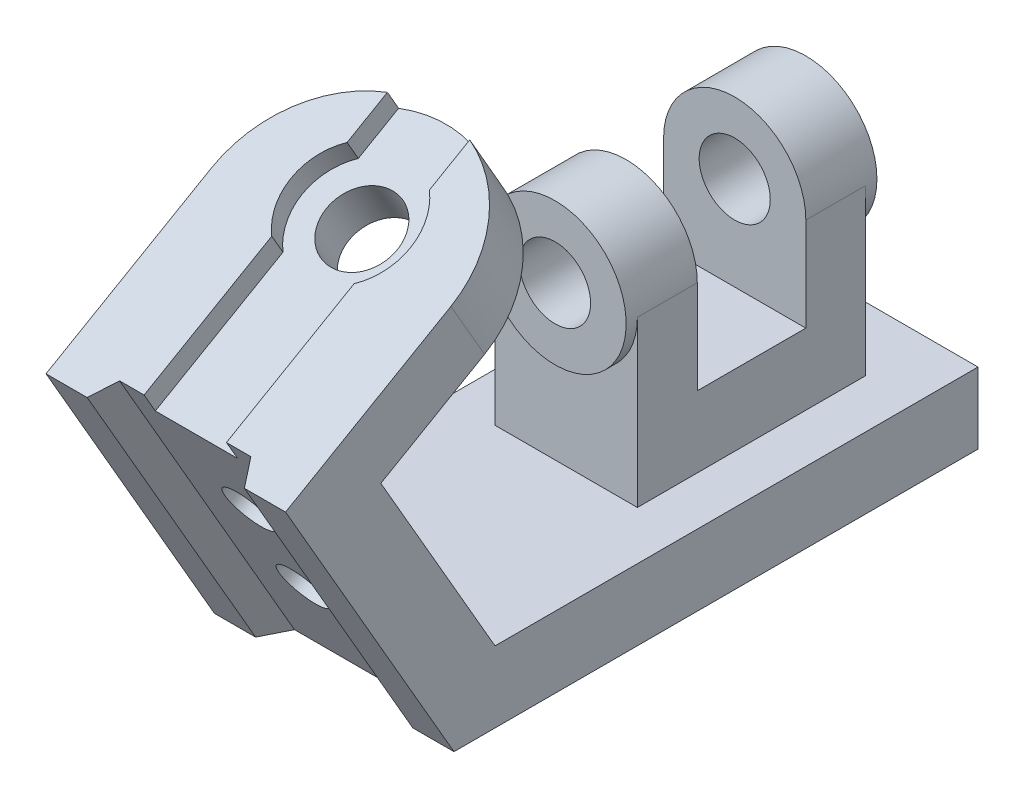
ISO-10303-21;
HEADER;
FILE_DESCRIPTION(('STEP AP214'),'2;1');
FILE_NAME('part.step','',(''),(''),'','','');
FILE_SCHEMA(('AUTOMOTIVE_DESIGN { 1 0 10303 214 1 1 1 1 }'));
ENDSEC;
DATA;
#1=APPLICATION_CONTEXT('core data for automotive mechanical design processes');
#2=APPLICATION_PROTOCOL_DEFINITION('international standard','automotive_design',2000,#1);
#3=PRODUCT_CONTEXT('',#1,'mechanical');
#4=PRODUCT('Part','Part','',(#3));
#5=PRODUCT_RELATED_PRODUCT_CATEGORY('part','',(#4));
#6=PRODUCT_DEFINITION_FORMATION('','',#4);
#7=PRODUCT_DEFINITION_CONTEXT('part definition',#1,'design');
#8=PRODUCT_DEFINITION('design','',#6,#7);
#9=PRODUCT_DEFINITION_SHAPE('','',#8);
#10=(LENGTH_UNIT() NAMED_UNIT(*) SI_UNIT(.MILLI.,.METRE.));
#11=(NAMED_UNIT(*) PLANE_ANGLE_UNIT() SI_UNIT($,.RADIAN.));
#12=(NAMED_UNIT(*) SI_UNIT($,.STERADIAN.) SOLID_ANGLE_UNIT());
#13=UNCERTAINTY_MEASURE_WITH_UNIT(LENGTH_MEASURE(1.E-05),#10,'distance_accuracy_value','');
#14=(GEOMETRIC_REPRESENTATION_CONTEXT(3) GLOBAL_UNCERTAINTY_ASSIGNED_CONTEXT((#13)) GLOBAL_UNIT_ASSIGNED_CONTEXT((#10,
#11,#12)) REPRESENTATION_CONTEXT('',''));
#15=CARTESIAN_POINT('',(0.,0.,0.));
#16=DIRECTION('',(0.,0.,1.));
#17=DIRECTION('',(1.,0.,0.));
#18=AXIS2_PLACEMENT_3D('',#15,#16,#17);
#19=CARTESIAN_POINT('',(21.0141016151378,75.7461339178927,36.8038475772938));
#20=DIRECTION('',(-1.,0.,0.));
#21=DIRECTION('',(0.,0.,1.));
#22=AXIS2_PLACEMENT_3D('',#19,#20,#21);
#23=PLANE('',#22);
#24=DIRECTION('',(0.,-0.500000000000005,0.866025403784436));
#25=VECTOR('',#24,1.);
#26=CARTESIAN_POINT('',(21.0141016151378,75.7461339178927,36.8038475772938));
#27=LINE('',#26,#25);
#28=CARTESIAN_POINT('',(21.0141016151378,95.4366588985818,2.69885788303656));
#29=VERTEX_POINT('',#28);
#30=CARTESIAN_POINT('',(21.0141016151378,75.7461339178927,36.8038475772938));
#31=VERTEX_POINT('',#30);
#32=EDGE_CURVE('E270',#29,#31,#27,.T.);
#33=ORIENTED_EDGE('',*,*,#32,.F.);
#34=DIRECTION('',(0.,0.866025403784436,0.500000000000004));
#35=VECTOR('',#34,1.);
#36=CARTESIAN_POINT('',(21.0141016151378,95.4366588985817,2.69885788303655));
#37=LINE('',#36,#35);
#38=CARTESIAN_POINT('',(21.0141016151378,100.632811321288,5.69885788303657));
#39=VERTEX_POINT('',#38);
#40=EDGE_CURVE('E551',#29,#39,#37,.T.);
#41=ORIENTED_EDGE('',*,*,#40,.T.);
#42=DIRECTION('',(0.,-0.500000000000005,0.866025403784436));
#43=VECTOR('',#42,1.);
#44=CARTESIAN_POINT('',(21.0141016151378,80.9422863405993,39.8038475772938));
#45=LINE('',#44,#43);
#46=CARTESIAN_POINT('',(21.0141016151378,80.9422863405993,39.8038475772938));
#47=VERTEX_POINT('',#46);
#48=EDGE_CURVE('E267',#39,#47,#45,.T.);
#49=ORIENTED_EDGE('',*,*,#48,.T.);
#50=DIRECTION('',(0.,0.866025403784436,0.500000000000004));
#51=VECTOR('',#50,1.);
#52=CARTESIAN_POINT('',(21.0141016151378,75.7461339178927,36.8038475772938));
#53=LINE('',#52,#51);
#54=EDGE_CURVE('E251',#31,#47,#53,.T.);
#55=ORIENTED_EDGE('',*,*,#54,.F.);
#56=EDGE_LOOP('',(#33,#41,#49,#55));
#57=FACE_BOUND('',#56,.T.);
#58=ADVANCED_FACE('F45',(#57),#23,.F.);
#59=CARTESIAN_POINT('',(43.0141016151378,75.7461339178927,36.8038475772938));
#60=DIRECTION('',(1.,0.,0.));
#61=DIRECTION('',(0.,0.,-1.));
#62=AXIS2_PLACEMENT_3D('',#59,#60,#61);
#63=PLANE('',#62);
#64=DIRECTION('',(0.,0.500000000000005,-0.866025403784436));
#65=VECTOR('',#64,1.);
#66=CARTESIAN_POINT('',(43.0141016151378,75.7461339178927,36.8038475772938));
#67=LINE('',#66,#65);
#68=CARTESIAN_POINT('',(43.0141016151378,107.055608937204,-17.4257539144615));
#69=VERTEX_POINT('',#68);
#70=CARTESIAN_POINT('',(43.0141016151378,113.268530244806,-28.1868492826555));
#71=VERTEX_POINT('',#70);
#72=EDGE_CURVE('E252',#69,#71,#67,.T.);
#73=ORIENTED_EDGE('',*,*,#72,.F.);
#74=DIRECTION('',(0.,0.866025403784436,0.500000000000004));
#75=VECTOR('',#74,1.);
#76=CARTESIAN_POINT('',(43.0141016151378,107.055608937204,-17.4257539144615));
#77=LINE('',#76,#75);
#78=CARTESIAN_POINT('',(43.0141016151378,112.251761359911,-14.4257539144615));
#79=VERTEX_POINT('',#78);
#80=EDGE_CURVE('E233',#69,#79,#77,.T.);
#81=ORIENTED_EDGE('',*,*,#80,.T.);
#82=DIRECTION('',(0.,0.500000000000005,-0.866025403784436));
#83=VECTOR('',#82,1.);
#84=CARTESIAN_POINT('',(43.0141016151378,80.9422863405993,39.8038475772938));
#85=LINE('',#84,#83);
#86=CARTESIAN_POINT('',(43.0141016151378,118.464682667513,-25.1868492826555));
#87=VERTEX_POINT('',#86);
#88=EDGE_CURVE('E266',#79,#87,#85,.T.);
#89=ORIENTED_EDGE('',*,*,#88,.T.);
#90=DIRECTION('',(0.,0.866025403784436,0.500000000000004));
#91=VECTOR('',#90,1.);
#92=CARTESIAN_POINT('',(43.0141016151378,102.876225399393,-34.1868492826556));
#93=LINE('',#92,#91);
#94=EDGE_CURVE('E276',#87,#71,#93,.F.);
#95=ORIENTED_EDGE('',*,*,#94,.T.);
#96=EDGE_LOOP('',(#73,#81,#89,#95));
#97=FACE_BOUND('',#96,.T.);
#98=ADVANCED_FACE('F691',(#97),#63,.F.);
#99=CARTESIAN_POINT('',(64.,77.9422863405993,45.0000000000004));
#100=DIRECTION('',(0.,0.866025403784436,0.500000000000004));
#101=DIRECTION('',(0.,-0.500000000000004,0.866025403784436));
#102=AXIS2_PLACEMENT_3D('',#99,#100,#101);
#103=PLANE('',#102);
#104=CARTESIAN_POINT('',(32.0141016151378,106.4422863406,-4.36344801571245));
#105=DIRECTION('',(0.,0.866025403784436,0.500000000000005));
#106=DIRECTION('',(0.,-0.500000000000004,0.866025403784436));
#107=AXIS2_PLACEMENT_3D('',#104,#105,#106);
#108=CIRCLE('',#107,16.);
#109=CARTESIAN_POINT('',(21.0141016151378,112.251761359911,-14.4257539144615));
#110=VERTEX_POINT('',#109);
#111=EDGE_CURVE('E563',#110,#39,#108,.T.);
#112=ORIENTED_EDGE('',*,*,#111,.F.);
#113=CARTESIAN_POINT('',(21.0141016151378,118.469844664205,-25.1957901231954));
#114=VERTEX_POINT('',#113);
#115=EDGE_CURVE('E262',#114,#110,#45,.T.);
#116=ORIENTED_EDGE('',*,*,#115,.F.);
#117=CARTESIAN_POINT('',(32.,103.4422863406,0.83270440699415));
#118=DIRECTION('',(0.,0.866025403784436,0.500000000000005));
#119=DIRECTION('',(0.,0.500000000000004,-0.866025403784436));
#120=AXIS2_PLACEMENT_3D('',#117,#118,#119);
#121=CIRCLE('',#120,32.);
#122=CARTESIAN_POINT('',(0.,103.4422863406,0.83270440699415));
#123=VERTEX_POINT('',#122);
#124=EDGE_CURVE('E406',#114,#123,#121,.T.);
#125=ORIENTED_EDGE('',*,*,#124,.T.);
#126=DIRECTION('',(0.,0.500000000000004,-0.866025403784436));
#127=VECTOR('',#126,1.);
#128=CARTESIAN_POINT('',(0.,77.9422863405993,45.0000000000004));
#129=LINE('',#128,#127);
#130=CARTESIAN_POINT('',(0.,77.9422863405993,45.0000000000004));
#131=VERTEX_POINT('',#130);
#132=EDGE_CURVE('E461',#131,#123,#129,.T.);
#133=ORIENTED_EDGE('',*,*,#132,.F.);
#134=DIRECTION('',(-1.,0.,0.));
#135=VECTOR('',#134,1.);
#136=CARTESIAN_POINT('',(64.,77.9422863405993,45.0000000000004));
#137=LINE('',#136,#135);
#138=CARTESIAN_POINT('',(11.,77.9422863405993,45.0000000000004));
#139=VERTEX_POINT('',#138);
#140=EDGE_CURVE('E493',#139,#131,#137,.T.);
#141=ORIENTED_EDGE('',*,*,#140,.F.);
#142=DIRECTION('',(0.500000000000004,0.433012701892221,-0.749999999999996));
#143=VECTOR('',#142,1.);
#144=CARTESIAN_POINT('',(11.,77.9422863405993,45.0000000000004));
#145=LINE('',#144,#143);
#146=CARTESIAN_POINT('',(14.4641016151378,80.9422863405993,39.8038475772938));
#147=VERTEX_POINT('',#146);
#148=EDGE_CURVE('E292',#139,#147,#145,.T.);
#149=ORIENTED_EDGE('',*,*,#148,.T.);
#150=DIRECTION('',(1.,0.,0.));
#151=VECTOR('',#150,1.);
#152=CARTESIAN_POINT('',(14.4641016151378,80.9422863405993,39.8038475772938));
#153=LINE('',#152,#151);
#154=EDGE_CURVE('E288',#147,#47,#153,.T.);
#155=ORIENTED_EDGE('',*,*,#154,.T.);
#156=ORIENTED_EDGE('',*,*,#48,.F.);
#157=EDGE_LOOP('',(#112,#116,#125,#133,#141,#149,#155,#156));
#158=FACE_BOUND('',#157,.T.);
#159=ADVANCED_FACE('F532',(#158),#103,.T.);
#160=CARTESIAN_POINT('',(43.0141016151378,100.632811321288,5.69885788303658));
#161=VERTEX_POINT('',#160);
#162=EDGE_CURVE('E561',#161,#79,#108,.T.);
#163=ORIENTED_EDGE('',*,*,#162,.F.);
#164=CARTESIAN_POINT('',(43.0141016151378,80.9422863405993,39.8038475772938));
#165=VERTEX_POINT('',#164);
#166=EDGE_CURVE('E243',#165,#161,#85,.T.);
#167=ORIENTED_EDGE('',*,*,#166,.F.);
#168=CARTESIAN_POINT('',(49.5358983848622,80.9422863405993,39.8038475772938));
#169=VERTEX_POINT('',#168);
#170=EDGE_CURVE('E287',#165,#169,#153,.T.);
#171=ORIENTED_EDGE('',*,*,#170,.T.);
#172=DIRECTION('',(-0.500000000000005,0.433012701892221,-0.749999999999996));
#173=VECTOR('',#172,1.);
#174=CARTESIAN_POINT('',(53.,77.9422863405993,45.0000000000004));
#175=LINE('',#174,#173);
#176=CARTESIAN_POINT('',(53.,77.9422863405993,45.0000000000004));
#177=VERTEX_POINT('',#176);
#178=EDGE_CURVE('E283',#177,#169,#175,.T.);
#179=ORIENTED_EDGE('',*,*,#178,.F.);
#180=CARTESIAN_POINT('',(64.,77.9422863405993,45.0000000000004));
#181=VERTEX_POINT('',#180);
#182=EDGE_CURVE('E494',#181,#177,#137,.T.);
#183=ORIENTED_EDGE('',*,*,#182,.F.);
#184=DIRECTION('',(0.,0.500000000000004,-0.866025403784436));
#185=VECTOR('',#184,1.);
#186=CARTESIAN_POINT('',(64.,77.9422863405993,45.0000000000004));
#187=LINE('',#186,#185);
#188=CARTESIAN_POINT('',(64.,103.4422863406,0.832704406994148));
#189=VERTEX_POINT('',#188);
#190=EDGE_CURVE('E439',#181,#189,#187,.T.);
#191=ORIENTED_EDGE('',*,*,#190,.T.);
#192=EDGE_CURVE('E411',#189,#87,#121,.T.);
#193=ORIENTED_EDGE('',*,*,#192,.T.);
#194=ORIENTED_EDGE('',*,*,#88,.F.);
#195=EDGE_LOOP('',(#163,#167,#171,#179,#183,#191,#193,#194));
#196=FACE_BOUND('',#195,.T.);
#197=ADVANCED_FACE('F542',(#196),#103,.T.);
#198=CARTESIAN_POINT('',(64.,0.,0.));
#199=DIRECTION('',(0.,-0.500000000000004,0.866025403784436));
#200=DIRECTION('',(0.,-0.866025403784436,-0.500000000000004));
#201=AXIS2_PLACEMENT_3D('',#198,#199,#200);
#202=PLANE('',#201);
#203=DIRECTION('',(-1.,0.,0.));
#204=VECTOR('',#203,1.);
#205=CARTESIAN_POINT('',(64.,0.,0.));
#206=LINE('',#205,#204);
#207=CARTESIAN_POINT('',(11.,0.,0.));
#208=VERTEX_POINT('',#207);
#209=CARTESIAN_POINT('',(0.,0.,0.));
#210=VERTEX_POINT('',#209);
#211=EDGE_CURVE('E488',#208,#210,#206,.T.);
#212=ORIENTED_EDGE('',*,*,#211,.F.);
#213=DIRECTION('',(0.,0.866025403784436,0.500000000000004));
#214=VECTOR('',#213,1.);
#215=CARTESIAN_POINT('',(11.,-60.6217782649111,-35.0000000000007));
#216=LINE('',#215,#214);
#217=EDGE_CURVE('E297',#208,#139,#216,.T.);
#218=ORIENTED_EDGE('',*,*,#217,.T.);
#219=ORIENTED_EDGE('',*,*,#140,.T.);
#220=DIRECTION('',(0.,0.866025403784436,0.500000000000004));
#221=VECTOR('',#220,1.);
#222=CARTESIAN_POINT('',(0.,0.,0.));
#223=LINE('',#222,#221);
#224=EDGE_CURVE('E465',#210,#131,#223,.T.);
#225=ORIENTED_EDGE('',*,*,#224,.F.);
#226=EDGE_LOOP('',(#212,#218,#219,#225));
#227=FACE_BOUND('',#226,.T.);
#228=ADVANCED_FACE('F527',(#227),#202,.T.);
#229=CARTESIAN_POINT('',(64.,0.,0.));
#230=DIRECTION('',(0.,-1.,0.));
#231=DIRECTION('',(0.,0.,-1.));
#232=AXIS2_PLACEMENT_3D('',#229,#230,#231);
#233=PLANE('',#232);
#234=DIRECTION('',(-1.,0.,0.));
#235=VECTOR('',#234,1.);
#236=CARTESIAN_POINT('',(64.,0.,-6.92820323027554));
#237=LINE('',#236,#235);
#238=CARTESIAN_POINT('',(49.5358983848622,0.,-6.92820323027555));
#239=VERTEX_POINT('',#238);
#240=CARTESIAN_POINT('',(14.4641016151378,0.,-6.92820323027554));
#241=VERTEX_POINT('',#240);
#242=EDGE_CURVE('E54',#239,#241,#237,.T.);
#243=ORIENTED_EDGE('',*,*,#242,.T.);
#244=DIRECTION('',(-0.447213595499961,0.,0.894427190999915));
#245=VECTOR('',#244,1.);
#246=CARTESIAN_POINT('',(21.6000000000001,0.,-21.2000000000001));
#247=LINE('',#246,#245);
#248=EDGE_CURVE('E11',#241,#208,#247,.T.);
#249=ORIENTED_EDGE('',*,*,#248,.T.);
#250=ORIENTED_EDGE('',*,*,#211,.T.);
#251=DIRECTION('',(0.,0.,1.));
#252=VECTOR('',#251,1.);
#253=CARTESIAN_POINT('',(0.,0.,0.));
#254=LINE('',#253,#252);
#255=CARTESIAN_POINT('',(0.,0.,-140.));
#256=VERTEX_POINT('',#255);
#257=EDGE_CURVE('E469',#256,#210,#254,.T.);
#258=ORIENTED_EDGE('',*,*,#257,.F.);
#259=DIRECTION('',(-1.,0.,0.));
#260=VECTOR('',#259,1.);
#261=CARTESIAN_POINT('',(64.,0.,-140.));
#262=LINE('',#261,#260);
#263=CARTESIAN_POINT('',(64.,0.,-140.));
#264=VERTEX_POINT('',#263);
#265=EDGE_CURVE('E485',#264,#256,#262,.T.);
#266=ORIENTED_EDGE('',*,*,#265,.F.);
#267=DIRECTION('',(0.,0.,1.));
#268=VECTOR('',#267,1.);
#269=CARTESIAN_POINT('',(64.,0.,0.));
#270=LINE('',#269,#268);
#271=CARTESIAN_POINT('',(64.,0.,0.));
#272=VERTEX_POINT('',#271);
#273=EDGE_CURVE('E446',#264,#272,#270,.T.);
#274=ORIENTED_EDGE('',*,*,#273,.T.);
#275=CARTESIAN_POINT('',(53.,0.,0.));
#276=VERTEX_POINT('',#275);
#277=EDGE_CURVE('E489',#272,#276,#206,.T.);
#278=ORIENTED_EDGE('',*,*,#277,.T.);
#279=DIRECTION('',(0.447213595499962,0.,0.894427190999914));
#280=VECTOR('',#279,1.);
#281=CARTESIAN_POINT('',(55.2000000000001,0.,4.40000000000002));
#282=LINE('',#281,#280);
#283=EDGE_CURVE('E509',#239,#276,#282,.T.);
#284=ORIENTED_EDGE('',*,*,#283,.F.);
#285=EDGE_LOOP('',(#243,#249,#250,#258,#266,#274,#278,#284));
#286=FACE_BOUND('',#285,.T.);
#287=ADVANCED_FACE('F516',(#286),#233,.T.);
#288=CARTESIAN_POINT('',(64.,19.,0.));
#289=DIRECTION('',(0.,-1.,0.));
#290=DIRECTION('',(0.,0.,-1.));
#291=AXIS2_PLACEMENT_3D('',#288,#289,#290);
#292=PLANE('',#291);
#293=DIRECTION('',(0.,0.,-1.));
#294=VECTOR('',#293,1.);
#295=CARTESIAN_POINT('',(0.,19.,0.));
#296=LINE('',#295,#294);
#297=CARTESIAN_POINT('',(0.,19.,-140.));
#298=VERTEX_POINT('',#297);
#299=CARTESIAN_POINT('',(0.,19.,-10.9696551146028));
#300=VERTEX_POINT('',#299);
#301=EDGE_CURVE('E440',#298,#300,#296,.F.);
#302=ORIENTED_EDGE('',*,*,#301,.T.);
#303=DIRECTION('',(-1.,0.,0.));
#304=VECTOR('',#303,1.);
#305=CARTESIAN_POINT('',(64.,19.,-10.9696551146028));
#306=LINE('',#305,#304);
#307=CARTESIAN_POINT('',(64.,19.,-10.9696551146028));
#308=VERTEX_POINT('',#307);
#309=EDGE_CURVE('E457',#308,#300,#306,.T.);
#310=ORIENTED_EDGE('',*,*,#309,.F.);
#311=DIRECTION('',(0.,0.,-1.));
#312=VECTOR('',#311,1.);
#313=CARTESIAN_POINT('',(64.,19.,0.));
#314=LINE('',#313,#312);
#315=CARTESIAN_POINT('',(64.,19.,-140.));
#316=VERTEX_POINT('',#315);
#317=EDGE_CURVE('E454',#316,#308,#314,.F.);
#318=ORIENTED_EDGE('',*,*,#317,.F.);
#319=DIRECTION('',(-1.,0.,0.));
#320=VECTOR('',#319,1.);
#321=CARTESIAN_POINT('',(64.,19.,-140.));
#322=LINE('',#321,#320);
#323=EDGE_CURVE('E482',#316,#298,#322,.T.);
#324=ORIENTED_EDGE('',*,*,#323,.T.);
#325=EDGE_LOOP('',(#302,#310,#318,#324));
#326=FACE_BOUND('',#325,.T.);
#327=DIRECTION('',(0.,0.,-1.));
#328=VECTOR('',#327,1.);
#329=CARTESIAN_POINT('',(51.,19.,-62.));
#330=LINE('',#329,#328);
#331=CARTESIAN_POINT('',(51.,19.,-62.));
#332=VERTEX_POINT('',#331);
#333=CARTESIAN_POINT('',(51.,19.,-123.));
#334=VERTEX_POINT('',#333);
#335=EDGE_CURVE('E372',#332,#334,#330,.T.);
#336=ORIENTED_EDGE('',*,*,#335,.F.);
#337=DIRECTION('',(-1.,0.,0.));
#338=VECTOR('',#337,1.);
#339=CARTESIAN_POINT('',(51.,19.,-62.));
#340=LINE('',#339,#338);
#341=CARTESIAN_POINT('',(13.,19.,-62.));
#342=VERTEX_POINT('',#341);
#343=EDGE_CURVE('E402',#332,#342,#340,.T.);
#344=ORIENTED_EDGE('',*,*,#343,.T.);
#345=DIRECTION('',(0.,0.,-1.));
#346=VECTOR('',#345,1.);
#347=CARTESIAN_POINT('',(13.,19.,-62.));
#348=LINE('',#347,#346);
#349=CARTESIAN_POINT('',(13.,19.,-123.));
#350=VERTEX_POINT('',#349);
#351=EDGE_CURVE('E388',#342,#350,#348,.T.);
#352=ORIENTED_EDGE('',*,*,#351,.T.);
#353=DIRECTION('',(-1.,0.,0.));
#354=VECTOR('',#353,1.);
#355=CARTESIAN_POINT('',(51.,19.,-123.));
#356=LINE('',#355,#354);
#357=EDGE_CURVE('E384',#334,#350,#356,.T.);
#358=ORIENTED_EDGE('',*,*,#357,.F.);
#359=EDGE_LOOP('',(#336,#344,#352,#358));
#360=FACE_BOUND('',#359,.T.);
#361=ADVANCED_FACE('F609',(#326,#360),#292,.F.);
#362=CARTESIAN_POINT('',(64.,9.50000000000008,-16.4544826719043));
#363=DIRECTION('',(0.,-0.500000000000004,0.866025403784436));
#364=DIRECTION('',(0.,-0.866025403784436,-0.500000000000004));
#365=AXIS2_PLACEMENT_3D('',#362,#363,#364);
#366=PLANE('',#365);
#367=CARTESIAN_POINT('',(32.0141016151378,57.9974226119286,11.545517328096));
#368=DIRECTION('',(0.,-0.500000000000004,0.866025403784436));
#369=DIRECTION('',(0.,-0.866025403784436,-0.500000000000004));
#370=AXIS2_PLACEMENT_3D('',#367,#368,#369);
#371=CIRCLE('',#370,6.50000000000001);
#372=CARTESIAN_POINT('',(32.0141016151378,52.3682574873297,8.29551732809594));
#373=VERTEX_POINT('',#372);
#374=EDGE_CURVE('E573',#373,#373,#371,.T.);
#375=ORIENTED_EDGE('',*,*,#374,.T.);
#376=EDGE_LOOP('',(#375));
#377=FACE_BOUND('',#376,.T.);
#378=CARTESIAN_POINT('',(32.0141016151378,32.8826859021799,-2.95448267190415));
#379=DIRECTION('',(0.,-0.500000000000004,0.866025403784436));
#380=DIRECTION('',(0.,-0.866025403784436,-0.500000000000004));
#381=AXIS2_PLACEMENT_3D('',#378,#379,#380);
#382=CIRCLE('',#381,6.5);
#383=CARTESIAN_POINT('',(32.0141016151378,27.2535207775811,-6.20448267190418));
#384=VERTEX_POINT('',#383);
#385=EDGE_CURVE('E577',#384,#384,#382,.T.);
#386=ORIENTED_EDGE('',*,*,#385,.T.);
#387=EDGE_LOOP('',(#386));
#388=FACE_BOUND('',#387,.T.);
#389=DIRECTION('',(0.,0.866025403784436,0.500000000000004));
#390=VECTOR('',#389,1.);
#391=CARTESIAN_POINT('',(0.,9.50000000000008,-16.4544826719043));
#392=LINE('',#391,#390);
#393=CARTESIAN_POINT('',(0.,71.8538290724795,19.545517328096));
#394=VERTEX_POINT('',#393);
#395=EDGE_CURVE('E434',#300,#394,#392,.T.);
#396=ORIENTED_EDGE('',*,*,#395,.T.);
#397=DIRECTION('',(1.,0.,0.));
#398=VECTOR('',#397,1.);
#399=CARTESIAN_POINT('',(64.,71.8538290724795,19.545517328096));
#400=LINE('',#399,#398);
#401=CARTESIAN_POINT('',(64.,71.8538290724795,19.545517328096));
#402=VERTEX_POINT('',#401);
#403=EDGE_CURVE('E427',#394,#402,#400,.T.);
#404=ORIENTED_EDGE('',*,*,#403,.T.);
#405=DIRECTION('',(0.,0.866025403784436,0.500000000000004));
#406=VECTOR('',#405,1.);
#407=CARTESIAN_POINT('',(64.,9.50000000000008,-16.4544826719043));
#408=LINE('',#407,#406);
#409=EDGE_CURVE('E435',#308,#402,#408,.T.);
#410=ORIENTED_EDGE('',*,*,#409,.F.);
#411=ORIENTED_EDGE('',*,*,#309,.T.);
#412=EDGE_LOOP('',(#396,#404,#410,#411));
#413=FACE_BOUND('',#412,.T.);
#414=ADVANCED_FACE('F47',(#377,#388,#413),#366,.F.);
#415=DIRECTION('',(0.,0.866025403784436,0.500000000000004));
#416=VECTOR('',#415,1.);
#417=CARTESIAN_POINT('',(53.,-60.6217782649111,-35.0000000000007));
#418=LINE('',#417,#416);
#419=EDGE_CURVE('E296',#276,#177,#418,.T.);
#420=ORIENTED_EDGE('',*,*,#419,.F.);
#421=ORIENTED_EDGE('',*,*,#277,.F.);
#422=DIRECTION('',(0.,0.866025403784436,0.500000000000004));
#423=VECTOR('',#422,1.);
#424=CARTESIAN_POINT('',(64.,0.,0.));
#425=LINE('',#424,#423);
#426=EDGE_CURVE('E443',#272,#181,#425,.T.);
#427=ORIENTED_EDGE('',*,*,#426,.T.);
#428=ORIENTED_EDGE('',*,*,#182,.T.);
#429=EDGE_LOOP('',(#420,#421,#427,#428));
#430=FACE_BOUND('',#429,.T.);
#431=ADVANCED_FACE('F608',(#430),#202,.T.);
#432=CARTESIAN_POINT('',(64.,19.,-140.));
#433=DIRECTION('',(0.,0.,-1.));
#434=DIRECTION('',(-1.,0.,0.));
#435=AXIS2_PLACEMENT_3D('',#432,#433,#434);
#436=PLANE('',#435);
#437=DIRECTION('',(0.,-1.,0.));
#438=VECTOR('',#437,1.);
#439=CARTESIAN_POINT('',(0.,19.,-140.));
#440=LINE('',#439,#438);
#441=EDGE_CURVE('E473',#298,#256,#440,.T.);
#442=ORIENTED_EDGE('',*,*,#441,.F.);
#443=ORIENTED_EDGE('',*,*,#323,.F.);
#444=DIRECTION('',(0.,-1.,0.));
#445=VECTOR('',#444,1.);
#446=CARTESIAN_POINT('',(64.,19.,-140.));
#447=LINE('',#446,#445);
#448=EDGE_CURVE('E450',#316,#264,#447,.T.);
#449=ORIENTED_EDGE('',*,*,#448,.T.);
#450=ORIENTED_EDGE('',*,*,#265,.T.);
#451=EDGE_LOOP('',(#442,#443,#449,#450));
#452=FACE_BOUND('',#451,.T.);
#453=ADVANCED_FACE('F639',(#452),#436,.T.);
#454=CARTESIAN_POINT('',(64.,0.,0.));
#455=DIRECTION('',(-1.,0.,0.));
#456=DIRECTION('',(0.,0.,1.));
#457=AXIS2_PLACEMENT_3D('',#454,#455,#456);
#458=PLANE('',#457);
#459=ORIENTED_EDGE('',*,*,#409,.T.);
#460=DIRECTION('',(0.,0.500000000000005,-0.866025403784436));
#461=VECTOR('',#460,1.);
#462=CARTESIAN_POINT('',(64.,87.8538290724797,-8.16729559300592));
#463=LINE('',#462,#461);
#464=CARTESIAN_POINT('',(64.,87.8538290724797,-8.16729559300593));
#465=VERTEX_POINT('',#464);
#466=EDGE_CURVE('E407',#402,#465,#463,.T.);
#467=ORIENTED_EDGE('',*,*,#466,.T.);
#468=DIRECTION('',(0.,0.866025403784436,0.500000000000004));
#469=VECTOR('',#468,1.);
#470=CARTESIAN_POINT('',(64.,87.8538290724797,-8.16729559300593));
#471=LINE('',#470,#469);
#472=EDGE_CURVE('E419',#465,#189,#471,.T.);
#473=ORIENTED_EDGE('',*,*,#472,.T.);
#474=ORIENTED_EDGE('',*,*,#190,.F.);
#475=ORIENTED_EDGE('',*,*,#426,.F.);
#476=ORIENTED_EDGE('',*,*,#273,.F.);
#477=ORIENTED_EDGE('',*,*,#448,.F.);
#478=ORIENTED_EDGE('',*,*,#317,.T.);
#479=EDGE_LOOP('',(#459,#467,#473,#474,#475,#476,#477,#478));
#480=FACE_BOUND('',#479,.T.);
#481=ADVANCED_FACE('F624',(#480),#458,.F.);
#482=CARTESIAN_POINT('',(0.,0.,0.));
#483=DIRECTION('',(-1.,0.,0.));
#484=DIRECTION('',(0.,0.,1.));
#485=AXIS2_PLACEMENT_3D('',#482,#483,#484);
#486=PLANE('',#485);
#487=ORIENTED_EDGE('',*,*,#224,.T.);
#488=ORIENTED_EDGE('',*,*,#132,.T.);
#489=DIRECTION('',(0.,0.866025403784436,0.500000000000004));
#490=VECTOR('',#489,1.);
#491=CARTESIAN_POINT('',(0.,87.8538290724797,-8.16729559300593));
#492=LINE('',#491,#490);
#493=CARTESIAN_POINT('',(0.,87.8538290724797,-8.16729559300593));
#494=VERTEX_POINT('',#493);
#495=EDGE_CURVE('E423',#494,#123,#492,.T.);
#496=ORIENTED_EDGE('',*,*,#495,.F.);
#497=DIRECTION('',(0.,-0.500000000000004,0.866025403784436));
#498=VECTOR('',#497,1.);
#499=CARTESIAN_POINT('',(0.,62.3538290724794,36.0000000000003));
#500=LINE('',#499,#498);
#501=EDGE_CURVE('E415',#494,#394,#500,.T.);
#502=ORIENTED_EDGE('',*,*,#501,.T.);
#503=ORIENTED_EDGE('',*,*,#395,.F.);
#504=ORIENTED_EDGE('',*,*,#301,.F.);
#505=ORIENTED_EDGE('',*,*,#441,.T.);
#506=ORIENTED_EDGE('',*,*,#257,.T.);
#507=EDGE_LOOP('',(#487,#488,#496,#502,#503,#504,#505,#506));
#508=FACE_BOUND('',#507,.T.);
#509=ADVANCED_FACE('F616',(#508),#486,.T.);
#510=CARTESIAN_POINT('',(32.,87.8538290724797,-8.16729559300593));
#511=DIRECTION('',(0.,-0.866025403784436,-0.500000000000005));
#512=DIRECTION('',(0.,0.500000000000004,-0.866025403784436));
#513=AXIS2_PLACEMENT_3D('',#510,#511,#512);
#514=PLANE('',#513);
#515=CARTESIAN_POINT('',(32.0141016151378,90.8538290724797,-13.3634480157125));
#516=DIRECTION('',(0.,-0.866025403784436,-0.500000000000005));
#517=DIRECTION('',(0.,0.500000000000004,-0.866025403784436));
#518=AXIS2_PLACEMENT_3D('',#515,#516,#517);
#519=CIRCLE('',#518,9.5);
#520=CARTESIAN_POINT('',(32.0141016151378,95.6038290724797,-21.5906893516647));
#521=VERTEX_POINT('',#520);
#522=EDGE_CURVE('E565',#521,#521,#519,.T.);
#523=ORIENTED_EDGE('',*,*,#522,.F.);
#524=EDGE_LOOP('',(#523));
#525=FACE_BOUND('',#524,.T.);
#526=ORIENTED_EDGE('',*,*,#403,.F.);
#527=ORIENTED_EDGE('',*,*,#501,.F.);
#528=CARTESIAN_POINT('',(32.,87.8538290724797,-8.16729559300593));
#529=DIRECTION('',(0.,0.866025403784436,0.500000000000005));
#530=DIRECTION('',(0.,0.500000000000004,-0.866025403784436));
#531=AXIS2_PLACEMENT_3D('',#528,#529,#530);
#532=CIRCLE('',#531,32.);
#533=EDGE_CURVE('E410',#465,#494,#532,.T.);
#534=ORIENTED_EDGE('',*,*,#533,.F.);
#535=ORIENTED_EDGE('',*,*,#466,.F.);
#536=EDGE_LOOP('',(#526,#527,#534,#535));
#537=FACE_BOUND('',#536,.T.);
#538=ADVANCED_FACE('F621',(#525,#537),#514,.T.);
#539=CARTESIAN_POINT('',(32.,87.8538290724797,-8.16729559300593));
#540=DIRECTION('',(0.,0.866025403784436,0.500000000000004));
#541=DIRECTION('',(0.,-0.500000000000005,0.866025403784436));
#542=AXIS2_PLACEMENT_3D('',#539,#540,#541);
#543=CYLINDRICAL_SURFACE('',#542,32.);
#544=DIRECTION('',(0.,0.866025403784436,0.500000000000004));
#545=VECTOR('',#544,1.);
#546=CARTESIAN_POINT('',(21.0141016151378,102.881387396085,-34.1957901231955));
#547=LINE('',#546,#545);
#548=CARTESIAN_POINT('',(21.0141016151378,113.273692241499,-28.1957901231954));
#549=VERTEX_POINT('',#548);
#550=EDGE_CURVE('E280',#549,#114,#547,.T.);
#551=ORIENTED_EDGE('',*,*,#550,.F.);
#552=CARTESIAN_POINT('',(32.,98.2461339178929,-2.16729559300587));
#553=DIRECTION('',(0.,-0.866025403784436,-0.500000000000005));
#554=DIRECTION('',(0.,0.500000000000005,-0.866025403784436));
#555=AXIS2_PLACEMENT_3D('',#552,#553,#554);
#556=CIRCLE('',#555,32.);
#557=EDGE_CURVE('E272',#71,#549,#556,.F.);
#558=ORIENTED_EDGE('',*,*,#557,.F.);
#559=ORIENTED_EDGE('',*,*,#94,.F.);
#560=ORIENTED_EDGE('',*,*,#192,.F.);
#561=ORIENTED_EDGE('',*,*,#472,.F.);
#562=ORIENTED_EDGE('',*,*,#533,.T.);
#563=ORIENTED_EDGE('',*,*,#495,.T.);
#564=ORIENTED_EDGE('',*,*,#124,.F.);
#565=EDGE_LOOP('',(#551,#558,#559,#560,#561,#562,#563,#564));
#566=FACE_BOUND('',#565,.T.);
#567=ADVANCED_FACE('F629',(#566),#543,.T.);
#568=CARTESIAN_POINT('',(51.,19.,-62.));
#569=DIRECTION('',(0.,0.,-1.));
#570=DIRECTION('',(-1.,0.,0.));
#571=AXIS2_PLACEMENT_3D('',#568,#569,#570);
#572=PLANE('',#571);
#573=CARTESIAN_POINT('',(32.,63.,-62.));
#574=DIRECTION('',(0.,0.,-1.));
#575=DIRECTION('',(-1.,0.,0.));
#576=AXIS2_PLACEMENT_3D('',#573,#574,#575);
#577=CIRCLE('',#576,19.);
#578=CARTESIAN_POINT('',(13.,63.,-62.));
#579=VERTEX_POINT('',#578);
#580=CARTESIAN_POINT('',(51.,63.,-62.));
#581=VERTEX_POINT('',#580);
#582=EDGE_CURVE('E339',#579,#581,#577,.F.);
#583=ORIENTED_EDGE('',*,*,#582,.F.);
#584=DIRECTION('',(0.,-1.,0.));
#585=VECTOR('',#584,1.);
#586=CARTESIAN_POINT('',(13.,19.,-62.));
#587=LINE('',#586,#585);
#588=EDGE_CURVE('E366',#579,#342,#587,.T.);
#589=ORIENTED_EDGE('',*,*,#588,.T.);
#590=ORIENTED_EDGE('',*,*,#343,.F.);
#591=DIRECTION('',(0.,-1.,0.));
#592=VECTOR('',#591,1.);
#593=CARTESIAN_POINT('',(51.,19.,-62.));
#594=LINE('',#593,#592);
#595=EDGE_CURVE('E369',#581,#332,#594,.T.);
#596=ORIENTED_EDGE('',*,*,#595,.F.);
#597=EDGE_LOOP('',(#583,#589,#590,#596));
#598=FACE_BOUND('',#597,.T.);
#599=ADVANCED_FACE('F678',(#598),#572,.F.);
#600=CARTESIAN_POINT('',(51.,19.,-123.));
#601=DIRECTION('',(0.,0.,1.));
#602=DIRECTION('',(1.,0.,0.));
#603=AXIS2_PLACEMENT_3D('',#600,#601,#602);
#604=PLANE('',#603);
#605=CARTESIAN_POINT('',(32.,63.,-123.));
#606=DIRECTION('',(0.,0.,1.));
#607=DIRECTION('',(1.,0.,0.));
#608=AXIS2_PLACEMENT_3D('',#605,#606,#607);
#609=CIRCLE('',#608,19.);
#610=CARTESIAN_POINT('',(51.,63.,-123.));
#611=VERTEX_POINT('',#610);
#612=CARTESIAN_POINT('',(13.,63.,-123.));
#613=VERTEX_POINT('',#612);
#614=EDGE_CURVE('E346',#611,#613,#609,.F.);
#615=ORIENTED_EDGE('',*,*,#614,.F.);
#616=DIRECTION('',(0.,1.,0.));
#617=VECTOR('',#616,1.);
#618=CARTESIAN_POINT('',(51.,19.,-123.));
#619=LINE('',#618,#617);
#620=EDGE_CURVE('E376',#334,#611,#619,.T.);
#621=ORIENTED_EDGE('',*,*,#620,.F.);
#622=ORIENTED_EDGE('',*,*,#357,.T.);
#623=DIRECTION('',(0.,1.,0.));
#624=VECTOR('',#623,1.);
#625=CARTESIAN_POINT('',(13.,19.,-123.));
#626=LINE('',#625,#624);
#627=EDGE_CURVE('E392',#350,#613,#626,.T.);
#628=ORIENTED_EDGE('',*,*,#627,.T.);
#629=EDGE_LOOP('',(#615,#621,#622,#628));
#630=FACE_BOUND('',#629,.T.);
#631=ADVANCED_FACE('F655',(#630),#604,.F.);
#632=CARTESIAN_POINT('',(51.,0.,0.));
#633=DIRECTION('',(-1.,0.,0.));
#634=DIRECTION('',(0.,0.,1.));
#635=AXIS2_PLACEMENT_3D('',#632,#633,#634);
#636=PLANE('',#635);
#637=DIRECTION('',(0.,0.,-1.));
#638=VECTOR('',#637,1.);
#639=CARTESIAN_POINT('',(51.,38.,-78.));
#640=LINE('',#639,#638);
#641=CARTESIAN_POINT('',(51.,38.,-78.));
#642=VERTEX_POINT('',#641);
#643=CARTESIAN_POINT('',(51.,38.,-107.));
#644=VERTEX_POINT('',#643);
#645=EDGE_CURVE('E354',#642,#644,#640,.T.);
#646=ORIENTED_EDGE('',*,*,#645,.F.);
#647=DIRECTION('',(0.,-1.,0.));
#648=VECTOR('',#647,1.);
#649=CARTESIAN_POINT('',(51.,63.,-78.));
#650=LINE('',#649,#648);
#651=CARTESIAN_POINT('',(51.,63.,-78.));
#652=VERTEX_POINT('',#651);
#653=EDGE_CURVE('E350',#652,#642,#650,.T.);
#654=ORIENTED_EDGE('',*,*,#653,.F.);
#655=DIRECTION('',(0.,0.,1.));
#656=VECTOR('',#655,1.);
#657=CARTESIAN_POINT('',(51.,63.,-62.));
#658=LINE('',#657,#656);
#659=EDGE_CURVE('E380',#652,#581,#658,.T.);
#660=ORIENTED_EDGE('',*,*,#659,.T.);
#661=ORIENTED_EDGE('',*,*,#595,.T.);
#662=ORIENTED_EDGE('',*,*,#335,.T.);
#663=ORIENTED_EDGE('',*,*,#620,.T.);
#664=CARTESIAN_POINT('',(51.,63.,-107.));
#665=VERTEX_POINT('',#664);
#666=EDGE_CURVE('E381',#611,#665,#658,.T.);
#667=ORIENTED_EDGE('',*,*,#666,.T.);
#668=DIRECTION('',(0.,1.,0.));
#669=VECTOR('',#668,1.);
#670=CARTESIAN_POINT('',(51.,63.,-107.));
#671=LINE('',#670,#669);
#672=EDGE_CURVE('E358',#644,#665,#671,.T.);
#673=ORIENTED_EDGE('',*,*,#672,.F.);
#674=EDGE_LOOP('',(#646,#654,#660,#661,#662,#663,#667,#673));
#675=FACE_BOUND('',#674,.T.);
#676=ADVANCED_FACE('F651',(#675),#636,.F.);
#677=CARTESIAN_POINT('',(13.,0.,0.));
#678=DIRECTION('',(-1.,0.,0.));
#679=DIRECTION('',(0.,0.,1.));
#680=AXIS2_PLACEMENT_3D('',#677,#678,#679);
#681=PLANE('',#680);
#682=DIRECTION('',(0.,1.,0.));
#683=VECTOR('',#682,1.);
#684=CARTESIAN_POINT('',(13.,0.,-78.));
#685=LINE('',#684,#683);
#686=CARTESIAN_POINT('',(13.,38.,-78.));
#687=VERTEX_POINT('',#686);
#688=CARTESIAN_POINT('',(13.,63.,-78.));
#689=VERTEX_POINT('',#688);
#690=EDGE_CURVE('E505',#687,#689,#685,.T.);
#691=ORIENTED_EDGE('',*,*,#690,.F.);
#692=DIRECTION('',(0.,0.,1.));
#693=VECTOR('',#692,1.);
#694=CARTESIAN_POINT('',(13.,38.,0.));
#695=LINE('',#694,#693);
#696=CARTESIAN_POINT('',(13.,38.,-107.));
#697=VERTEX_POINT('',#696);
#698=EDGE_CURVE('E498',#697,#687,#695,.T.);
#699=ORIENTED_EDGE('',*,*,#698,.F.);
#700=DIRECTION('',(0.,-1.,0.));
#701=VECTOR('',#700,1.);
#702=CARTESIAN_POINT('',(13.,0.,-107.));
#703=LINE('',#702,#701);
#704=CARTESIAN_POINT('',(13.,63.,-107.));
#705=VERTEX_POINT('',#704);
#706=EDGE_CURVE('E501',#705,#697,#703,.T.);
#707=ORIENTED_EDGE('',*,*,#706,.F.);
#708=DIRECTION('',(0.,0.,1.));
#709=VECTOR('',#708,1.);
#710=CARTESIAN_POINT('',(13.,63.,-62.));
#711=LINE('',#710,#709);
#712=EDGE_CURVE('E373',#613,#705,#711,.T.);
#713=ORIENTED_EDGE('',*,*,#712,.F.);
#714=ORIENTED_EDGE('',*,*,#627,.F.);
#715=ORIENTED_EDGE('',*,*,#351,.F.);
#716=ORIENTED_EDGE('',*,*,#588,.F.);
#717=EDGE_CURVE('E395',#689,#579,#711,.T.);
#718=ORIENTED_EDGE('',*,*,#717,.F.);
#719=EDGE_LOOP('',(#691,#699,#707,#713,#714,#715,#716,#718));
#720=FACE_BOUND('',#719,.T.);
#721=ADVANCED_FACE('F675',(#720),#681,.T.);
#722=CARTESIAN_POINT('',(0.,63.,-78.));
#723=DIRECTION('',(0.,0.,1.));
#724=DIRECTION('',(1.,0.,0.));
#725=AXIS2_PLACEMENT_3D('',#722,#723,#724);
#726=PLANE('',#725);
#727=CARTESIAN_POINT('',(32.,63.,-78.));
#728=DIRECTION('',(0.,0.,1.));
#729=DIRECTION('',(1.,0.,0.));
#730=AXIS2_PLACEMENT_3D('',#727,#728,#729);
#731=CIRCLE('',#730,9.50000000000001);
#732=CARTESIAN_POINT('',(41.5,63.,-78.));
#733=VERTEX_POINT('',#732);
#734=EDGE_CURVE('E322',#733,#733,#731,.T.);
#735=ORIENTED_EDGE('',*,*,#734,.T.);
#736=EDGE_LOOP('',(#735));
#737=FACE_BOUND('',#736,.T.);
#738=ORIENTED_EDGE('',*,*,#690,.T.);
#739=CARTESIAN_POINT('',(32.,63.,-78.));
#740=DIRECTION('',(0.,0.,-1.));
#741=DIRECTION('',(-1.,0.,0.));
#742=AXIS2_PLACEMENT_3D('',#739,#740,#741);
#743=CIRCLE('',#742,19.);
#744=EDGE_CURVE('E326',#689,#652,#743,.T.);
#745=ORIENTED_EDGE('',*,*,#744,.T.);
#746=ORIENTED_EDGE('',*,*,#653,.T.);
#747=DIRECTION('',(1.,0.,0.));
#748=VECTOR('',#747,1.);
#749=CARTESIAN_POINT('',(0.,38.,-78.));
#750=LINE('',#749,#748);
#751=EDGE_CURVE('E362',#687,#642,#750,.T.);
#752=ORIENTED_EDGE('',*,*,#751,.F.);
#753=EDGE_LOOP('',(#738,#745,#746,#752));
#754=FACE_BOUND('',#753,.T.);
#755=ADVANCED_FACE('F672',(#737,#754),#726,.F.);
#756=CARTESIAN_POINT('',(0.,63.,-107.));
#757=DIRECTION('',(0.,0.,-1.));
#758=DIRECTION('',(0.,1.,0.));
#759=AXIS2_PLACEMENT_3D('',#756,#757,#758);
#760=PLANE('',#759);
#761=CARTESIAN_POINT('',(32.,63.,-107.));
#762=DIRECTION('',(0.,0.,-1.));
#763=DIRECTION('',(0.,1.,0.));
#764=AXIS2_PLACEMENT_3D('',#761,#762,#763);
#765=CIRCLE('',#764,9.50000000000001);
#766=CARTESIAN_POINT('',(32.,72.5,-107.));
#767=VERTEX_POINT('',#766);
#768=EDGE_CURVE('E318',#767,#767,#765,.T.);
#769=ORIENTED_EDGE('',*,*,#768,.T.);
#770=EDGE_LOOP('',(#769));
#771=FACE_BOUND('',#770,.T.);
#772=ORIENTED_EDGE('',*,*,#672,.T.);
#773=CARTESIAN_POINT('',(32.,63.,-107.));
#774=DIRECTION('',(0.,0.,1.));
#775=DIRECTION('',(1.,0.,0.));
#776=AXIS2_PLACEMENT_3D('',#773,#774,#775);
#777=CIRCLE('',#776,19.);
#778=EDGE_CURVE('E331',#665,#705,#777,.T.);
#779=ORIENTED_EDGE('',*,*,#778,.T.);
#780=ORIENTED_EDGE('',*,*,#706,.T.);
#781=DIRECTION('',(1.,0.,0.));
#782=VECTOR('',#781,1.);
#783=CARTESIAN_POINT('',(0.,38.,-107.));
#784=LINE('',#783,#782);
#785=EDGE_CURVE('E363',#697,#644,#784,.T.);
#786=ORIENTED_EDGE('',*,*,#785,.T.);
#787=EDGE_LOOP('',(#772,#779,#780,#786));
#788=FACE_BOUND('',#787,.T.);
#789=ADVANCED_FACE('F662',(#771,#788),#760,.F.);
#790=CARTESIAN_POINT('',(0.,38.,-78.));
#791=DIRECTION('',(0.,-1.,0.));
#792=DIRECTION('',(0.,0.,-1.));
#793=AXIS2_PLACEMENT_3D('',#790,#791,#792);
#794=PLANE('',#793);
#795=ORIENTED_EDGE('',*,*,#698,.T.);
#796=ORIENTED_EDGE('',*,*,#751,.T.);
#797=ORIENTED_EDGE('',*,*,#645,.T.);
#798=ORIENTED_EDGE('',*,*,#785,.F.);
#799=EDGE_LOOP('',(#795,#796,#797,#798));
#800=FACE_BOUND('',#799,.T.);
#801=ADVANCED_FACE('F665',(#800),#794,.F.);
#802=CARTESIAN_POINT('',(32.,63.,-126.));
#803=DIRECTION('',(0.,0.,1.));
#804=DIRECTION('',(1.,0.,0.));
#805=AXIS2_PLACEMENT_3D('',#802,#803,#804);
#806=CYLINDRICAL_SURFACE('',#805,19.);
#807=CARTESIAN_POINT('',(32.,63.,-126.));
#808=DIRECTION('',(0.,0.,1.));
#809=DIRECTION('',(1.,0.,0.));
#810=AXIS2_PLACEMENT_3D('',#807,#808,#809);
#811=CIRCLE('',#810,19.);
#812=CARTESIAN_POINT('',(51.,63.,-126.));
#813=VERTEX_POINT('',#812);
#814=EDGE_CURVE('E335',#813,#813,#811,.T.);
#815=ORIENTED_EDGE('',*,*,#814,.T.);
#816=EDGE_LOOP('',(#815));
#817=FACE_BOUND('',#816,.T.);
#818=ORIENTED_EDGE('',*,*,#666,.F.);
#819=ORIENTED_EDGE('',*,*,#614,.T.);
#820=ORIENTED_EDGE('',*,*,#712,.T.);
#821=ORIENTED_EDGE('',*,*,#778,.F.);
#822=EDGE_LOOP('',(#818,#819,#820,#821));
#823=FACE_BOUND('',#822,.T.);
#824=ADVANCED_FACE('F658',(#817,#823),#806,.T.);
#825=CARTESIAN_POINT('',(32.,63.,-126.));
#826=DIRECTION('',(0.,0.,1.));
#827=DIRECTION('',(1.,0.,0.));
#828=AXIS2_PLACEMENT_3D('',#825,#826,#827);
#829=PLANE('',#828);
#830=CARTESIAN_POINT('',(32.,63.,-126.));
#831=DIRECTION('',(0.,0.,1.));
#832=DIRECTION('',(1.,0.,0.));
#833=AXIS2_PLACEMENT_3D('',#830,#831,#832);
#834=CIRCLE('',#833,9.50000000000001);
#835=CARTESIAN_POINT('',(41.5,63.,-126.));
#836=VERTEX_POINT('',#835);
#837=EDGE_CURVE('E314',#836,#836,#834,.T.);
#838=ORIENTED_EDGE('',*,*,#837,.T.);
#839=EDGE_LOOP('',(#838));
#840=FACE_BOUND('',#839,.T.);
#841=ORIENTED_EDGE('',*,*,#814,.F.);
#842=EDGE_LOOP('',(#841));
#843=FACE_BOUND('',#842,.T.);
#844=ADVANCED_FACE('F877',(#840,#843),#829,.F.);
#845=CARTESIAN_POINT('',(32.,63.,-59.));
#846=DIRECTION('',(0.,0.,-1.));
#847=DIRECTION('',(-1.,0.,0.));
#848=AXIS2_PLACEMENT_3D('',#845,#846,#847);
#849=CYLINDRICAL_SURFACE('',#848,19.);
#850=CARTESIAN_POINT('',(32.,63.,-59.));
#851=DIRECTION('',(0.,0.,-1.));
#852=DIRECTION('',(-1.,0.,0.));
#853=AXIS2_PLACEMENT_3D('',#850,#851,#852);
#854=CIRCLE('',#853,19.);
#855=CARTESIAN_POINT('',(13.,63.,-59.));
#856=VERTEX_POINT('',#855);
#857=EDGE_CURVE('E327',#856,#856,#854,.T.);
#858=ORIENTED_EDGE('',*,*,#857,.T.);
#859=EDGE_LOOP('',(#858));
#860=FACE_BOUND('',#859,.T.);
#861=ORIENTED_EDGE('',*,*,#582,.T.);
#862=ORIENTED_EDGE('',*,*,#659,.F.);
#863=ORIENTED_EDGE('',*,*,#744,.F.);
#864=ORIENTED_EDGE('',*,*,#717,.T.);
#865=EDGE_LOOP('',(#861,#862,#863,#864));
#866=FACE_BOUND('',#865,.T.);
#867=ADVANCED_FACE('F671',(#860,#866),#849,.T.);
#868=CARTESIAN_POINT('',(32.,63.,-59.));
#869=DIRECTION('',(0.,0.,-1.));
#870=DIRECTION('',(-1.,0.,0.));
#871=AXIS2_PLACEMENT_3D('',#868,#869,#870);
#872=PLANE('',#871);
#873=CARTESIAN_POINT('',(32.,63.,-59.));
#874=DIRECTION('',(0.,0.,1.));
#875=DIRECTION('',(1.,0.,0.));
#876=AXIS2_PLACEMENT_3D('',#873,#874,#875);
#877=CIRCLE('',#876,9.50000000000001);
#878=CARTESIAN_POINT('',(41.5,63.,-59.));
#879=VERTEX_POINT('',#878);
#880=EDGE_CURVE('E301',#879,#879,#877,.T.);
#881=ORIENTED_EDGE('',*,*,#880,.F.);
#882=EDGE_LOOP('',(#881));
#883=FACE_BOUND('',#882,.T.);
#884=ORIENTED_EDGE('',*,*,#857,.F.);
#885=EDGE_LOOP('',(#884));
#886=FACE_BOUND('',#885,.T.);
#887=ADVANCED_FACE('F861',(#883,#886),#872,.F.);
#888=CARTESIAN_POINT('',(32.,63.,-140.));
#889=DIRECTION('',(0.,0.,1.));
#890=DIRECTION('',(1.,0.,0.));
#891=AXIS2_PLACEMENT_3D('',#888,#889,#890);
#892=CYLINDRICAL_SURFACE('',#891,9.50000000000001);
#893=ORIENTED_EDGE('',*,*,#880,.T.);
#894=EDGE_LOOP('',(#893));
#895=FACE_BOUND('',#894,.T.);
#896=ORIENTED_EDGE('',*,*,#734,.F.);
#897=EDGE_LOOP('',(#896));
#898=FACE_BOUND('',#897,.T.);
#899=ADVANCED_FACE('F852',(#895,#898),#892,.F.);
#900=ORIENTED_EDGE('',*,*,#837,.F.);
#901=EDGE_LOOP('',(#900));
#902=FACE_BOUND('',#901,.T.);
#903=ORIENTED_EDGE('',*,*,#768,.F.);
#904=EDGE_LOOP('',(#903));
#905=FACE_BOUND('',#904,.T.);
#906=ADVANCED_FACE('F822',(#902,#905),#892,.F.);
#907=CARTESIAN_POINT('',(11.,-60.6217782649111,-35.0000000000007));
#908=DIRECTION('',(0.866025403784436,-0.250000000000004,0.433012701892222));
#909=DIRECTION('',(0.447213595499961,0.,-0.894427190999915));
#910=AXIS2_PLACEMENT_3D('',#907,#908,#909);
#911=PLANE('',#910);
#912=DIRECTION('',(0.,0.866025403784436,0.500000000000004));
#913=VECTOR('',#912,1.);
#914=CARTESIAN_POINT('',(14.4641016151378,-57.6217782649111,-40.1961524227073));
#915=LINE('',#914,#913);
#916=EDGE_CURVE('E302',#241,#147,#915,.T.);
#917=ORIENTED_EDGE('',*,*,#916,.T.);
#918=ORIENTED_EDGE('',*,*,#148,.F.);
#919=ORIENTED_EDGE('',*,*,#217,.F.);
#920=ORIENTED_EDGE('',*,*,#248,.F.);
#921=EDGE_LOOP('',(#917,#918,#919,#920));
#922=FACE_BOUND('',#921,.T.);
#923=ADVANCED_FACE('F524',(#922),#911,.T.);
#924=CARTESIAN_POINT('',(14.4641016151378,-57.6217782649111,-40.1961524227073));
#925=DIRECTION('',(0.,-0.500000000000004,0.866025403784436));
#926=DIRECTION('',(0.,-0.866025403784436,-0.500000000000004));
#927=AXIS2_PLACEMENT_3D('',#924,#925,#926);
#928=PLANE('',#927);
#929=CARTESIAN_POINT('',(32.0141016151378,51.4974226119285,22.8038475772937));
#930=DIRECTION('',(0.,-0.500000000000004,0.866025403784436));
#931=DIRECTION('',(0.,-0.866025403784436,-0.500000000000004));
#932=AXIS2_PLACEMENT_3D('',#929,#930,#931);
#933=CIRCLE('',#932,6.50000000000001);
#934=CARTESIAN_POINT('',(32.0141016151378,45.8682574873297,19.5538475772936));
#935=VERTEX_POINT('',#934);
#936=EDGE_CURVE('E581',#935,#935,#933,.T.);
#937=ORIENTED_EDGE('',*,*,#936,.F.);
#938=EDGE_LOOP('',(#937));
#939=FACE_BOUND('',#938,.T.);
#940=CARTESIAN_POINT('',(32.0141016151378,26.3826859021798,8.30384757729352));
#941=DIRECTION('',(0.,-0.500000000000004,0.866025403784436));
#942=DIRECTION('',(0.,-0.866025403784436,-0.500000000000004));
#943=AXIS2_PLACEMENT_3D('',#940,#941,#942);
#944=CIRCLE('',#943,6.5);
#945=CARTESIAN_POINT('',(32.0141016151378,20.753520777581,5.05384757729349));
#946=VERTEX_POINT('',#945);
#947=EDGE_CURVE('E582',#946,#946,#944,.T.);
#948=ORIENTED_EDGE('',*,*,#947,.F.);
#949=EDGE_LOOP('',(#948));
#950=FACE_BOUND('',#949,.T.);
#951=ORIENTED_EDGE('',*,*,#54,.T.);
#952=ORIENTED_EDGE('',*,*,#154,.F.);
#953=ORIENTED_EDGE('',*,*,#916,.F.);
#954=ORIENTED_EDGE('',*,*,#242,.F.);
#955=DIRECTION('',(0.,0.866025403784436,0.500000000000004));
#956=VECTOR('',#955,1.);
#957=CARTESIAN_POINT('',(49.5358983848622,-57.6217782649111,-40.1961524227073));
#958=LINE('',#957,#956);
#959=EDGE_CURVE('E305',#239,#169,#958,.T.);
#960=ORIENTED_EDGE('',*,*,#959,.T.);
#961=ORIENTED_EDGE('',*,*,#170,.F.);
#962=DIRECTION('',(0.,0.866025403784436,0.500000000000004));
#963=VECTOR('',#962,1.);
#964=CARTESIAN_POINT('',(43.0141016151378,75.7461339178927,36.8038475772938));
#965=LINE('',#964,#963);
#966=CARTESIAN_POINT('',(43.0141016151378,75.7461339178927,36.8038475772938));
#967=VERTEX_POINT('',#966);
#968=EDGE_CURVE('E257',#967,#165,#965,.T.);
#969=ORIENTED_EDGE('',*,*,#968,.F.);
#970=DIRECTION('',(1.,0.,0.));
#971=VECTOR('',#970,1.);
#972=CARTESIAN_POINT('',(21.0141016151378,75.7461339178927,36.8038475772938));
#973=LINE('',#972,#971);
#974=EDGE_CURVE('E248',#31,#967,#973,.T.);
#975=ORIENTED_EDGE('',*,*,#974,.F.);
#976=EDGE_LOOP('',(#951,#952,#953,#954,#960,#961,#969,#975));
#977=FACE_BOUND('',#976,.T.);
#978=ADVANCED_FACE('F520',(#939,#950,#977),#928,.T.);
#979=CARTESIAN_POINT('',(53.,-60.6217782649111,-35.0000000000007));
#980=DIRECTION('',(0.866025403784436,0.250000000000005,-0.433012701892223));
#981=DIRECTION('',(-0.447213595499962,0.,-0.894427190999914));
#982=AXIS2_PLACEMENT_3D('',#979,#980,#981);
#983=PLANE('',#982);
#984=ORIENTED_EDGE('',*,*,#283,.T.);
#985=ORIENTED_EDGE('',*,*,#419,.T.);
#986=ORIENTED_EDGE('',*,*,#178,.T.);
#987=ORIENTED_EDGE('',*,*,#959,.F.);
#988=EDGE_LOOP('',(#984,#985,#986,#987));
#989=FACE_BOUND('',#988,.T.);
#990=ADVANCED_FACE('F595',(#989),#983,.F.);
#991=ORIENTED_EDGE('',*,*,#115,.T.);
#992=DIRECTION('',(0.,0.866025403784436,0.500000000000004));
#993=VECTOR('',#992,1.);
#994=CARTESIAN_POINT('',(21.0141016151378,107.055608937204,-17.4257539144615));
#995=LINE('',#994,#993);
#996=CARTESIAN_POINT('',(21.0141016151378,107.055608937204,-17.4257539144615));
#997=VERTEX_POINT('',#996);
#998=EDGE_CURVE('E555',#110,#997,#995,.F.);
#999=ORIENTED_EDGE('',*,*,#998,.T.);
#1000=EDGE_CURVE('E546',#549,#997,#27,.T.);
#1001=ORIENTED_EDGE('',*,*,#1000,.F.);
#1002=ORIENTED_EDGE('',*,*,#550,.T.);
#1003=EDGE_LOOP('',(#991,#999,#1001,#1002));
#1004=FACE_BOUND('',#1003,.T.);
#1005=ADVANCED_FACE('F694',(#1004),#23,.F.);
#1006=ORIENTED_EDGE('',*,*,#166,.T.);
#1007=DIRECTION('',(0.,0.866025403784436,0.500000000000004));
#1008=VECTOR('',#1007,1.);
#1009=CARTESIAN_POINT('',(43.0141016151378,95.4366588985817,2.69885788303655));
#1010=LINE('',#1009,#1008);
#1011=CARTESIAN_POINT('',(43.0141016151378,95.4366588985817,2.69885788303655));
#1012=VERTEX_POINT('',#1011);
#1013=EDGE_CURVE('E230',#161,#1012,#1010,.F.);
#1014=ORIENTED_EDGE('',*,*,#1013,.T.);
#1015=EDGE_CURVE('E240',#967,#1012,#67,.T.);
#1016=ORIENTED_EDGE('',*,*,#1015,.F.);
#1017=ORIENTED_EDGE('',*,*,#968,.T.);
#1018=EDGE_LOOP('',(#1006,#1014,#1016,#1017));
#1019=FACE_BOUND('',#1018,.T.);
#1020=ADVANCED_FACE('F239',(#1019),#63,.F.);
#1021=CARTESIAN_POINT('',(0.,72.7461339178927,42.0000000000004));
#1022=DIRECTION('',(0.,-0.866025403784436,-0.500000000000005));
#1023=DIRECTION('',(0.,0.500000000000005,-0.866025403784436));
#1024=AXIS2_PLACEMENT_3D('',#1021,#1022,#1023);
#1025=PLANE('',#1024);
#1026=CARTESIAN_POINT('',(32.0141016151378,101.246133917893,-7.36344801571246));
#1027=DIRECTION('',(0.,0.866025403784436,0.500000000000005));
#1028=DIRECTION('',(0.,-0.500000000000005,0.866025403784436));
#1029=AXIS2_PLACEMENT_3D('',#1026,#1027,#1028);
#1030=CIRCLE('',#1029,9.5);
#1031=CARTESIAN_POINT('',(32.0141016151378,96.4961339178929,0.863793320239685));
#1032=VERTEX_POINT('',#1031);
#1033=EDGE_CURVE('E569',#1032,#1032,#1030,.T.);
#1034=ORIENTED_EDGE('',*,*,#1033,.F.);
#1035=EDGE_LOOP('',(#1034));
#1036=FACE_BOUND('',#1035,.T.);
#1037=ORIENTED_EDGE('',*,*,#1000,.T.);
#1038=CARTESIAN_POINT('',(32.0141016151378,101.246133917893,-7.36344801571248));
#1039=DIRECTION('',(0.,0.866025403784436,0.500000000000005));
#1040=DIRECTION('',(0.,-0.500000000000004,0.866025403784436));
#1041=AXIS2_PLACEMENT_3D('',#1038,#1039,#1040);
#1042=CIRCLE('',#1041,16.);
#1043=EDGE_CURVE('E68',#997,#29,#1042,.T.);
#1044=ORIENTED_EDGE('',*,*,#1043,.T.);
#1045=ORIENTED_EDGE('',*,*,#32,.T.);
#1046=ORIENTED_EDGE('',*,*,#974,.T.);
#1047=ORIENTED_EDGE('',*,*,#1015,.T.);
#1048=EDGE_CURVE('E61',#1012,#69,#1042,.T.);
#1049=ORIENTED_EDGE('',*,*,#1048,.T.);
#1050=ORIENTED_EDGE('',*,*,#72,.T.);
#1051=ORIENTED_EDGE('',*,*,#557,.T.);
#1052=EDGE_LOOP('',(#1037,#1044,#1045,#1046,#1047,#1049,#1050,#1051));
#1053=FACE_BOUND('',#1052,.T.);
#1054=ADVANCED_FACE('F246',(#1036,#1053),#1025,.F.);
#1055=CARTESIAN_POINT('',(32.0141016151378,101.246133917893,-7.36344801571248));
#1056=DIRECTION('',(0.,0.866025403784436,0.500000000000004));
#1057=DIRECTION('',(0.,-0.500000000000004,0.866025403784436));
#1058=AXIS2_PLACEMENT_3D('',#1055,#1056,#1057);
#1059=CYLINDRICAL_SURFACE('',#1058,16.);
#1060=ORIENTED_EDGE('',*,*,#1048,.F.);
#1061=ORIENTED_EDGE('',*,*,#1013,.F.);
#1062=ORIENTED_EDGE('',*,*,#162,.T.);
#1063=ORIENTED_EDGE('',*,*,#80,.F.);
#1064=EDGE_LOOP('',(#1060,#1061,#1062,#1063));
#1065=FACE_BOUND('',#1064,.T.);
#1066=ADVANCED_FACE('F229',(#1065),#1059,.F.);
#1067=ORIENTED_EDGE('',*,*,#1043,.F.);
#1068=ORIENTED_EDGE('',*,*,#998,.F.);
#1069=ORIENTED_EDGE('',*,*,#111,.T.);
#1070=ORIENTED_EDGE('',*,*,#40,.F.);
#1071=EDGE_LOOP('',(#1067,#1068,#1069,#1070));
#1072=FACE_BOUND('',#1071,.T.);
#1073=ADVANCED_FACE('F719',(#1072),#1059,.F.);
#1074=CARTESIAN_POINT('',(32.0141016151378,84.7916512459887,-16.8634480157126));
#1075=DIRECTION('',(0.,0.866025403784436,0.500000000000005));
#1076=DIRECTION('',(0.,-0.500000000000005,0.866025403784436));
#1077=AXIS2_PLACEMENT_3D('',#1074,#1075,#1076);
#1078=CYLINDRICAL_SURFACE('',#1077,9.5);
#1079=ORIENTED_EDGE('',*,*,#522,.T.);
#1080=EDGE_LOOP('',(#1079));
#1081=FACE_BOUND('',#1080,.T.);
#1082=ORIENTED_EDGE('',*,*,#1033,.T.);
#1083=EDGE_LOOP('',(#1082));
#1084=FACE_BOUND('',#1083,.T.);
#1085=ADVANCED_FACE('F602',(#1081,#1084),#1078,.F.);
#1086=CARTESIAN_POINT('',(32.0141016151378,35.8826859021799,-8.15063509461077));
#1087=DIRECTION('',(0.,-0.500000000000004,0.866025403784436));
#1088=DIRECTION('',(0.,-0.866025403784436,-0.500000000000005));
#1089=AXIS2_PLACEMENT_3D('',#1086,#1087,#1088);
#1090=CYLINDRICAL_SURFACE('',#1089,6.5);
#1091=ORIENTED_EDGE('',*,*,#947,.T.);
#1092=EDGE_LOOP('',(#1091));
#1093=FACE_BOUND('',#1092,.T.);
#1094=ORIENTED_EDGE('',*,*,#385,.F.);
#1095=EDGE_LOOP('',(#1094));
#1096=FACE_BOUND('',#1095,.T.);
#1097=ADVANCED_FACE('F599',(#1093,#1096),#1090,.F.);
#1098=CARTESIAN_POINT('',(32.0141016151378,60.9974226119286,6.34936490538936));
#1099=DIRECTION('',(0.,-0.500000000000004,0.866025403784436));
#1100=DIRECTION('',(0.,-0.866025403784436,-0.500000000000005));
#1101=AXIS2_PLACEMENT_3D('',#1098,#1099,#1100);
#1102=CYLINDRICAL_SURFACE('',#1101,6.50000000000001);
#1103=ORIENTED_EDGE('',*,*,#936,.T.);
#1104=EDGE_LOOP('',(#1103));
#1105=FACE_BOUND('',#1104,.T.);
#1106=ORIENTED_EDGE('',*,*,#374,.F.);
#1107=EDGE_LOOP('',(#1106));
#1108=FACE_BOUND('',#1107,.T.);
#1109=ADVANCED_FACE('F590',(#1105,#1108),#1102,.F.);
#1110=CLOSED_SHELL('',(#58,#98,#159,#197,#228,#287,#361,#414,#431,#453,#481,#509,#538,#567,#599,
#631,#676,#721,#755,#789,#801,#824,#844,#867,#887,#899,#906,#923,#978,#990,#1005,#1020,#1054,
#1066,#1073,#1085,#1097,#1109));
#1111=MANIFOLD_SOLID_BREP('B2',#1110);
#1112=ADVANCED_BREP_SHAPE_REPRESENTATION('',(#18,#1111),#14);
#1113=SHAPE_DEFINITION_REPRESENTATION(#9,#1112);
ENDSEC;
END-ISO-10303-21;
